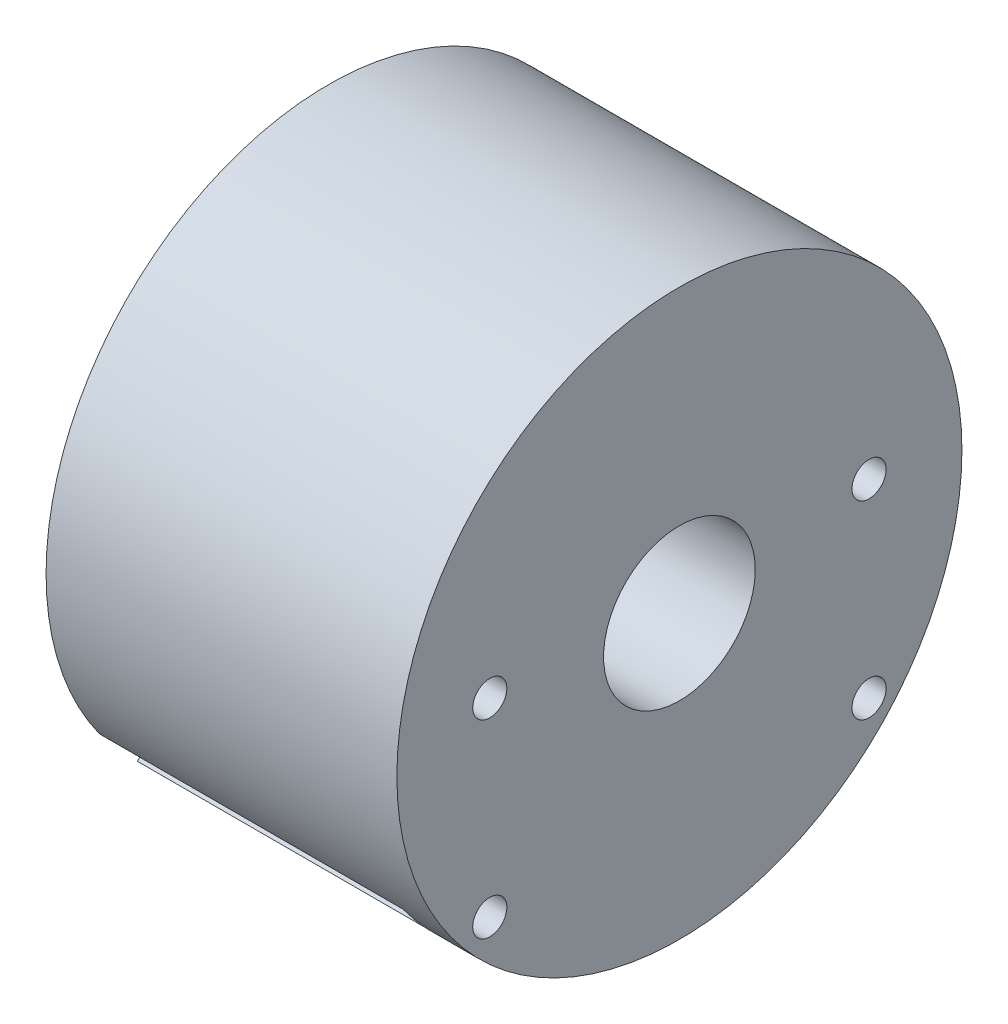
ISO-10303-21;
HEADER;
FILE_DESCRIPTION(('STEP AP214'),'2;1');
FILE_NAME('part.step','',(''),(''),'','','');
FILE_SCHEMA(('AUTOMOTIVE_DESIGN { 1 0 10303 214 1 1 1 1 }'));
ENDSEC;
DATA;
#1=APPLICATION_CONTEXT('core data for automotive mechanical design processes');
#2=APPLICATION_PROTOCOL_DEFINITION('international standard','automotive_design',2000,#1);
#3=PRODUCT_CONTEXT('',#1,'mechanical');
#4=PRODUCT('Part','Part','',(#3));
#5=PRODUCT_RELATED_PRODUCT_CATEGORY('part','',(#4));
#6=PRODUCT_DEFINITION_FORMATION('','',#4);
#7=PRODUCT_DEFINITION_CONTEXT('part definition',#1,'design');
#8=PRODUCT_DEFINITION('design','',#6,#7);
#9=PRODUCT_DEFINITION_SHAPE('','',#8);
#10=(LENGTH_UNIT() NAMED_UNIT(*) SI_UNIT(.MILLI.,.METRE.));
#11=(NAMED_UNIT(*) PLANE_ANGLE_UNIT() SI_UNIT($,.RADIAN.));
#12=(NAMED_UNIT(*) SI_UNIT($,.STERADIAN.) SOLID_ANGLE_UNIT());
#13=UNCERTAINTY_MEASURE_WITH_UNIT(LENGTH_MEASURE(1.E-05),#10,'distance_accuracy_value','');
#14=(GEOMETRIC_REPRESENTATION_CONTEXT(3) GLOBAL_UNCERTAINTY_ASSIGNED_CONTEXT((#13)) GLOBAL_UNIT_ASSIGNED_CONTEXT((#10,
#11,#12)) REPRESENTATION_CONTEXT('',''));
#15=CARTESIAN_POINT('',(0.,0.,0.));
#16=DIRECTION('',(0.,0.,1.));
#17=DIRECTION('',(1.,0.,0.));
#18=AXIS2_PLACEMENT_3D('',#15,#16,#17);
#19=CARTESIAN_POINT('',(-37.,0.,0.));
#20=DIRECTION('',(1.,0.,0.));
#21=DIRECTION('',(0.,0.,-1.));
#22=AXIS2_PLACEMENT_3D('',#19,#20,#21);
#23=PLANE('',#22);
#24=CARTESIAN_POINT('',(-37.,2.25000000000001,20.));
#25=DIRECTION('',(1.,0.,0.));
#26=DIRECTION('',(0.,0.,-1.));
#27=AXIS2_PLACEMENT_3D('',#24,#25,#26);
#28=CIRCLE('',#27,3.);
#29=CARTESIAN_POINT('',(-37.,2.25000000000001,17.));
#30=VERTEX_POINT('',#29);
#31=EDGE_CURVE('E117',#30,#30,#28,.T.);
#32=ORIENTED_EDGE('',*,*,#31,.T.);
#33=EDGE_LOOP('',(#32));
#34=FACE_BOUND('',#33,.T.);
#35=CARTESIAN_POINT('',(-37.,2.25000000000001,-20.));
#36=DIRECTION('',(1.,0.,0.));
#37=DIRECTION('',(0.,0.,-1.));
#38=AXIS2_PLACEMENT_3D('',#35,#36,#37);
#39=CIRCLE('',#38,3.);
#40=CARTESIAN_POINT('',(-37.,2.25000000000001,-23.));
#41=VERTEX_POINT('',#40);
#42=EDGE_CURVE('E177',#41,#41,#39,.T.);
#43=ORIENTED_EDGE('',*,*,#42,.T.);
#44=EDGE_LOOP('',(#43));
#45=FACE_BOUND('',#44,.T.);
#46=CARTESIAN_POINT('',(-37.,0.,0.));
#47=DIRECTION('',(1.,0.,0.));
#48=DIRECTION('',(0.,0.,-1.));
#49=AXIS2_PLACEMENT_3D('',#46,#47,#48);
#50=CIRCLE('',#49,8.);
#51=CARTESIAN_POINT('',(-37.,0.,-8.));
#52=VERTEX_POINT('',#51);
#53=EDGE_CURVE('E11',#52,#52,#50,.T.);
#54=ORIENTED_EDGE('',*,*,#53,.T.);
#55=EDGE_LOOP('',(#54));
#56=FACE_BOUND('',#55,.T.);
#57=CARTESIAN_POINT('',(-37.,0.,0.));
#58=DIRECTION('',(1.,0.,0.));
#59=DIRECTION('',(0.,0.,-1.));
#60=AXIS2_PLACEMENT_3D('',#57,#58,#59);
#61=CIRCLE('',#60,29.8);
#62=CARTESIAN_POINT('',(-37.,-17.4364781789354,-24.1662828899173));
#63=VERTEX_POINT('',#62);
#64=CARTESIAN_POINT('',(-37.,-17.4364781789354,24.1662828899173));
#65=VERTEX_POINT('',#64);
#66=EDGE_CURVE('E194',#63,#65,#61,.T.);
#67=ORIENTED_EDGE('',*,*,#66,.F.);
#68=DIRECTION('',(0.,-0.663783352029827,-0.747924903695583));
#69=VECTOR('',#68,1.);
#70=CARTESIAN_POINT('',(-37.,2.24377471108672,-1.99135005608946));
#71=LINE('',#70,#69);
#72=CARTESIAN_POINT('',(-37.,-15.5062252889132,-21.9913500560895));
#73=VERTEX_POINT('',#72);
#74=EDGE_CURVE('E161',#73,#63,#71,.T.);
#75=ORIENTED_EDGE('',*,*,#74,.F.);
#76=CARTESIAN_POINT('',(-37.,-17.75,-20.));
#77=DIRECTION('',(1.,0.,0.));
#78=DIRECTION('',(0.,0.,-1.));
#79=AXIS2_PLACEMENT_3D('',#76,#77,#78);
#80=CIRCLE('',#79,3.);
#81=CARTESIAN_POINT('',(-37.,-19.9937747110867,-18.0086499439105));
#82=VERTEX_POINT('',#81);
#83=EDGE_CURVE('E163',#73,#82,#80,.T.);
#84=ORIENTED_EDGE('',*,*,#83,.T.);
#85=DIRECTION('',(0.,-0.663783352029828,-0.747924903695582));
#86=VECTOR('',#85,1.);
#87=CARTESIAN_POINT('',(-37.,-2.24377471108677,1.99135005608951));
#88=LINE('',#87,#86);
#89=CARTESIAN_POINT('',(-37.,-21.9240276011089,-20.1835827777383));
#90=VERTEX_POINT('',#89);
#91=EDGE_CURVE('E153',#82,#90,#88,.T.);
#92=ORIENTED_EDGE('',*,*,#91,.T.);
#93=CARTESIAN_POINT('',(-37.,-21.9240276011089,20.1835827777383));
#94=VERTEX_POINT('',#93);
#95=EDGE_CURVE('E48',#94,#90,#61,.T.);
#96=ORIENTED_EDGE('',*,*,#95,.F.);
#97=DIRECTION('',(0.,-0.663783352029828,0.747924903695582));
#98=VECTOR('',#97,1.);
#99=CARTESIAN_POINT('',(-37.,-2.24377471108674,-1.99135005608948));
#100=LINE('',#99,#98);
#101=CARTESIAN_POINT('',(-37.,-19.9937747110867,18.0086499439105));
#102=VERTEX_POINT('',#101);
#103=EDGE_CURVE('E142',#102,#94,#100,.T.);
#104=ORIENTED_EDGE('',*,*,#103,.F.);
#105=CARTESIAN_POINT('',(-37.,-17.75,20.));
#106=DIRECTION('',(1.,0.,0.));
#107=DIRECTION('',(0.,0.,-1.));
#108=AXIS2_PLACEMENT_3D('',#105,#106,#107);
#109=CIRCLE('',#108,3.);
#110=CARTESIAN_POINT('',(-37.,-15.5062252889132,21.9913500560895));
#111=VERTEX_POINT('',#110);
#112=EDGE_CURVE('E113',#102,#111,#109,.T.);
#113=ORIENTED_EDGE('',*,*,#112,.T.);
#114=DIRECTION('',(0.,-0.66378335202983,0.747924903695581));
#115=VECTOR('',#114,1.);
#116=CARTESIAN_POINT('',(-37.,2.24377471108678,1.99135005608952));
#117=LINE('',#116,#115);
#118=EDGE_CURVE('E133',#111,#65,#117,.T.);
#119=ORIENTED_EDGE('',*,*,#118,.T.);
#120=EDGE_LOOP('',(#67,#75,#84,#92,#96,#104,#113,#119));
#121=FACE_BOUND('',#120,.T.);
#122=ADVANCED_FACE('F39',(#34,#45,#56,#121),#23,.F.);
#123=CARTESIAN_POINT('',(-37.,0.,0.));
#124=DIRECTION('',(1.,0.,0.));
#125=DIRECTION('',(0.,0.,-1.));
#126=AXIS2_PLACEMENT_3D('',#123,#124,#125);
#127=CYLINDRICAL_SURFACE('',#126,29.8);
#128=DIRECTION('',(-1.,0.,0.));
#129=VECTOR('',#128,1.);
#130=CARTESIAN_POINT('',(-5.,-17.4364781789354,-24.1662828899173));
#131=LINE('',#130,#129);
#132=CARTESIAN_POINT('',(-5.,-17.4364781789354,-24.1662828899173));
#133=VERTEX_POINT('',#132);
#134=EDGE_CURVE('E160',#133,#63,#131,.T.);
#135=ORIENTED_EDGE('',*,*,#134,.T.);
#136=ORIENTED_EDGE('',*,*,#66,.T.);
#137=DIRECTION('',(-1.,0.,0.));
#138=VECTOR('',#137,1.);
#139=CARTESIAN_POINT('',(-5.,-17.4364781789354,24.1662828899173));
#140=LINE('',#139,#138);
#141=CARTESIAN_POINT('',(-5.,-17.4364781789354,24.1662828899173));
#142=VERTEX_POINT('',#141);
#143=EDGE_CURVE('E64',#142,#65,#140,.T.);
#144=ORIENTED_EDGE('',*,*,#143,.F.);
#145=CARTESIAN_POINT('',(-5.,0.,0.));
#146=DIRECTION('',(1.,0.,0.));
#147=DIRECTION('',(0.,0.,-1.));
#148=AXIS2_PLACEMENT_3D('',#145,#146,#147);
#149=CIRCLE('',#148,29.8);
#150=CARTESIAN_POINT('',(-5.,-21.9240276011089,20.1835827777383));
#151=VERTEX_POINT('',#150);
#152=EDGE_CURVE('E140',#142,#151,#149,.T.);
#153=ORIENTED_EDGE('',*,*,#152,.T.);
#154=DIRECTION('',(-1.,0.,0.));
#155=VECTOR('',#154,1.);
#156=CARTESIAN_POINT('',(-5.,-21.9240276011089,20.1835827777383));
#157=LINE('',#156,#155);
#158=EDGE_CURVE('E132',#151,#94,#157,.T.);
#159=ORIENTED_EDGE('',*,*,#158,.T.);
#160=ORIENTED_EDGE('',*,*,#95,.T.);
#161=DIRECTION('',(-1.,0.,0.));
#162=VECTOR('',#161,1.);
#163=CARTESIAN_POINT('',(-5.,-21.9240276011089,-20.1835827777383));
#164=LINE('',#163,#162);
#165=CARTESIAN_POINT('',(-5.,-21.9240276011089,-20.1835827777383));
#166=VERTEX_POINT('',#165);
#167=EDGE_CURVE('E56',#166,#90,#164,.T.);
#168=ORIENTED_EDGE('',*,*,#167,.F.);
#169=CARTESIAN_POINT('',(-5.,0.,0.));
#170=DIRECTION('',(1.,0.,0.));
#171=DIRECTION('',(0.,0.,-1.));
#172=AXIS2_PLACEMENT_3D('',#169,#170,#171);
#173=CIRCLE('',#172,29.8);
#174=EDGE_CURVE('E157',#166,#133,#173,.T.);
#175=ORIENTED_EDGE('',*,*,#174,.T.);
#176=EDGE_LOOP('',(#135,#136,#144,#153,#159,#160,#168,#175));
#177=FACE_BOUND('',#176,.T.);
#178=CARTESIAN_POINT('',(0.,0.,0.));
#179=DIRECTION('',(1.,0.,0.));
#180=DIRECTION('',(0.,0.,-1.));
#181=AXIS2_PLACEMENT_3D('',#178,#179,#180);
#182=CIRCLE('',#181,29.8);
#183=CARTESIAN_POINT('',(0.,0.,-29.8));
#184=VERTEX_POINT('',#183);
#185=EDGE_CURVE('E193',#184,#184,#182,.T.);
#186=ORIENTED_EDGE('',*,*,#185,.F.);
#187=EDGE_LOOP('',(#186));
#188=FACE_BOUND('',#187,.T.);
#189=ADVANCED_FACE('F41',(#177,#188),#127,.T.);
#190=CARTESIAN_POINT('',(-37.,0.,0.));
#191=DIRECTION('',(1.,0.,0.));
#192=DIRECTION('',(0.,0.,-1.));
#193=AXIS2_PLACEMENT_3D('',#190,#191,#192);
#194=CYLINDRICAL_SURFACE('',#193,8.);
#195=ORIENTED_EDGE('',*,*,#53,.F.);
#196=EDGE_LOOP('',(#195));
#197=FACE_BOUND('',#196,.T.);
#198=CARTESIAN_POINT('',(0.,0.,0.));
#199=DIRECTION('',(1.,0.,0.));
#200=DIRECTION('',(0.,0.,-1.));
#201=AXIS2_PLACEMENT_3D('',#198,#199,#200);
#202=CIRCLE('',#201,8.);
#203=CARTESIAN_POINT('',(0.,0.,-8.));
#204=VERTEX_POINT('',#203);
#205=EDGE_CURVE('E196',#204,#204,#202,.T.);
#206=ORIENTED_EDGE('',*,*,#205,.T.);
#207=EDGE_LOOP('',(#206));
#208=FACE_BOUND('',#207,.T.);
#209=ADVANCED_FACE('F238',(#197,#208),#194,.F.);
#210=CARTESIAN_POINT('',(0.,0.,0.));
#211=DIRECTION('',(1.,0.,0.));
#212=DIRECTION('',(0.,0.,-1.));
#213=AXIS2_PLACEMENT_3D('',#210,#211,#212);
#214=PLANE('',#213);
#215=CARTESIAN_POINT('',(0.,2.25000000000001,-20.));
#216=DIRECTION('',(-1.,0.,0.));
#217=DIRECTION('',(0.,0.,1.));
#218=AXIS2_PLACEMENT_3D('',#215,#216,#217);
#219=CIRCLE('',#218,1.79999999999999);
#220=CARTESIAN_POINT('',(0.,2.25000000000001,-18.2));
#221=VERTEX_POINT('',#220);
#222=EDGE_CURVE('E181',#221,#221,#219,.T.);
#223=ORIENTED_EDGE('',*,*,#222,.T.);
#224=EDGE_LOOP('',(#223));
#225=FACE_BOUND('',#224,.T.);
#226=CARTESIAN_POINT('',(0.,2.25000000000001,20.));
#227=DIRECTION('',(-1.,0.,0.));
#228=DIRECTION('',(0.,0.,1.));
#229=AXIS2_PLACEMENT_3D('',#226,#227,#228);
#230=CIRCLE('',#229,1.79999999999999);
#231=CARTESIAN_POINT('',(0.,2.25000000000001,21.8));
#232=VERTEX_POINT('',#231);
#233=EDGE_CURVE('E184',#232,#232,#230,.T.);
#234=ORIENTED_EDGE('',*,*,#233,.T.);
#235=EDGE_LOOP('',(#234));
#236=FACE_BOUND('',#235,.T.);
#237=CARTESIAN_POINT('',(0.,-17.75,20.));
#238=DIRECTION('',(-1.,0.,0.));
#239=DIRECTION('',(0.,0.,1.));
#240=AXIS2_PLACEMENT_3D('',#237,#238,#239);
#241=CIRCLE('',#240,1.79999999999999);
#242=CARTESIAN_POINT('',(0.,-17.75,21.8));
#243=VERTEX_POINT('',#242);
#244=EDGE_CURVE('E187',#243,#243,#241,.T.);
#245=ORIENTED_EDGE('',*,*,#244,.T.);
#246=EDGE_LOOP('',(#245));
#247=FACE_BOUND('',#246,.T.);
#248=CARTESIAN_POINT('',(0.,-17.75,-20.));
#249=DIRECTION('',(-1.,0.,0.));
#250=DIRECTION('',(0.,0.,1.));
#251=AXIS2_PLACEMENT_3D('',#248,#249,#250);
#252=CIRCLE('',#251,1.79999999999999);
#253=CARTESIAN_POINT('',(0.,-17.75,-18.2));
#254=VERTEX_POINT('',#253);
#255=EDGE_CURVE('E190',#254,#254,#252,.T.);
#256=ORIENTED_EDGE('',*,*,#255,.T.);
#257=EDGE_LOOP('',(#256));
#258=FACE_BOUND('',#257,.T.);
#259=ORIENTED_EDGE('',*,*,#185,.T.);
#260=EDGE_LOOP('',(#259));
#261=FACE_BOUND('',#260,.T.);
#262=ORIENTED_EDGE('',*,*,#205,.F.);
#263=EDGE_LOOP('',(#262));
#264=FACE_BOUND('',#263,.T.);
#265=ADVANCED_FACE('F245',(#225,#236,#247,#258,#261,#264),#214,.T.);
#266=CARTESIAN_POINT('',(-37.,-17.75,-20.));
#267=DIRECTION('',(-1.,0.,0.));
#268=DIRECTION('',(0.,0.,1.));
#269=AXIS2_PLACEMENT_3D('',#266,#267,#268);
#270=CYLINDRICAL_SURFACE('',#269,1.79999999999999);
#271=CARTESIAN_POINT('',(-5.,-17.75,-20.));
#272=DIRECTION('',(1.,0.,0.));
#273=DIRECTION('',(0.,0.,-1.));
#274=AXIS2_PLACEMENT_3D('',#271,#272,#273);
#275=CIRCLE('',#274,1.79999999999999);
#276=CARTESIAN_POINT('',(-5.,-17.75,-21.8));
#277=VERTEX_POINT('',#276);
#278=EDGE_CURVE('E43',#277,#277,#275,.F.);
#279=ORIENTED_EDGE('',*,*,#278,.T.);
#280=EDGE_LOOP('',(#279));
#281=FACE_BOUND('',#280,.T.);
#282=ORIENTED_EDGE('',*,*,#255,.F.);
#283=EDGE_LOOP('',(#282));
#284=FACE_BOUND('',#283,.T.);
#285=ADVANCED_FACE('F213',(#281,#284),#270,.F.);
#286=CARTESIAN_POINT('',(-37.,-17.75,20.));
#287=DIRECTION('',(-1.,0.,0.));
#288=DIRECTION('',(0.,0.,1.));
#289=AXIS2_PLACEMENT_3D('',#286,#287,#288);
#290=CYLINDRICAL_SURFACE('',#289,1.79999999999999);
#291=CARTESIAN_POINT('',(-5.,-17.75,20.));
#292=DIRECTION('',(1.,0.,0.));
#293=DIRECTION('',(0.,0.,-1.));
#294=AXIS2_PLACEMENT_3D('',#291,#292,#293);
#295=CIRCLE('',#294,1.79999999999999);
#296=CARTESIAN_POINT('',(-5.,-17.75,18.2));
#297=VERTEX_POINT('',#296);
#298=EDGE_CURVE('E206',#297,#297,#295,.F.);
#299=ORIENTED_EDGE('',*,*,#298,.T.);
#300=EDGE_LOOP('',(#299));
#301=FACE_BOUND('',#300,.T.);
#302=ORIENTED_EDGE('',*,*,#244,.F.);
#303=EDGE_LOOP('',(#302));
#304=FACE_BOUND('',#303,.T.);
#305=ADVANCED_FACE('F292',(#301,#304),#290,.F.);
#306=CARTESIAN_POINT('',(-37.,2.25000000000001,20.));
#307=DIRECTION('',(-1.,0.,0.));
#308=DIRECTION('',(0.,0.,1.));
#309=AXIS2_PLACEMENT_3D('',#306,#307,#308);
#310=CYLINDRICAL_SURFACE('',#309,1.8);
#311=CARTESIAN_POINT('',(-5.,2.25000000000001,20.));
#312=DIRECTION('',(1.,0.,0.));
#313=DIRECTION('',(0.,0.,-1.));
#314=AXIS2_PLACEMENT_3D('',#311,#312,#313);
#315=CIRCLE('',#314,1.8);
#316=CARTESIAN_POINT('',(-5.,2.25000000000001,18.2));
#317=VERTEX_POINT('',#316);
#318=EDGE_CURVE('E204',#317,#317,#315,.F.);
#319=ORIENTED_EDGE('',*,*,#318,.T.);
#320=EDGE_LOOP('',(#319));
#321=FACE_BOUND('',#320,.T.);
#322=ORIENTED_EDGE('',*,*,#233,.F.);
#323=EDGE_LOOP('',(#322));
#324=FACE_BOUND('',#323,.T.);
#325=ADVANCED_FACE('F289',(#321,#324),#310,.F.);
#326=CARTESIAN_POINT('',(-37.,2.25000000000001,-20.));
#327=DIRECTION('',(-1.,0.,0.));
#328=DIRECTION('',(0.,0.,1.));
#329=AXIS2_PLACEMENT_3D('',#326,#327,#328);
#330=CYLINDRICAL_SURFACE('',#329,1.8);
#331=CARTESIAN_POINT('',(-5.,2.25000000000001,-20.));
#332=DIRECTION('',(1.,0.,0.));
#333=DIRECTION('',(0.,0.,-1.));
#334=AXIS2_PLACEMENT_3D('',#331,#332,#333);
#335=CIRCLE('',#334,1.8);
#336=CARTESIAN_POINT('',(-5.,2.25000000000001,-21.8));
#337=VERTEX_POINT('',#336);
#338=EDGE_CURVE('E176',#337,#337,#335,.F.);
#339=ORIENTED_EDGE('',*,*,#338,.T.);
#340=EDGE_LOOP('',(#339));
#341=FACE_BOUND('',#340,.T.);
#342=ORIENTED_EDGE('',*,*,#222,.F.);
#343=EDGE_LOOP('',(#342));
#344=FACE_BOUND('',#343,.T.);
#345=ADVANCED_FACE('F281',(#341,#344),#330,.F.);
#346=CARTESIAN_POINT('',(-5.,0.,0.));
#347=DIRECTION('',(1.,0.,0.));
#348=DIRECTION('',(0.,0.,-1.));
#349=AXIS2_PLACEMENT_3D('',#346,#347,#348);
#350=PLANE('',#349);
#351=CARTESIAN_POINT('',(-5.,2.25000000000001,-20.));
#352=DIRECTION('',(1.,0.,0.));
#353=DIRECTION('',(0.,0.,-1.));
#354=AXIS2_PLACEMENT_3D('',#351,#352,#353);
#355=CIRCLE('',#354,3.);
#356=CARTESIAN_POINT('',(-5.,2.25000000000001,-23.));
#357=VERTEX_POINT('',#356);
#358=EDGE_CURVE('E173',#357,#357,#355,.T.);
#359=ORIENTED_EDGE('',*,*,#358,.F.);
#360=EDGE_LOOP('',(#359));
#361=FACE_BOUND('',#360,.T.);
#362=ORIENTED_EDGE('',*,*,#338,.F.);
#363=EDGE_LOOP('',(#362));
#364=FACE_BOUND('',#363,.T.);
#365=ADVANCED_FACE('F277',(#361,#364),#350,.F.);
#366=CARTESIAN_POINT('',(-5.,2.25000000000001,-20.));
#367=DIRECTION('',(-1.,0.,0.));
#368=DIRECTION('',(0.,0.,1.));
#369=AXIS2_PLACEMENT_3D('',#366,#367,#368);
#370=CYLINDRICAL_SURFACE('',#369,3.);
#371=ORIENTED_EDGE('',*,*,#358,.T.);
#372=EDGE_LOOP('',(#371));
#373=FACE_BOUND('',#372,.T.);
#374=ORIENTED_EDGE('',*,*,#42,.F.);
#375=EDGE_LOOP('',(#374));
#376=FACE_BOUND('',#375,.T.);
#377=ADVANCED_FACE('F280',(#373,#376),#370,.F.);
#378=CARTESIAN_POINT('',(-5.,0.,0.));
#379=DIRECTION('',(1.,0.,0.));
#380=DIRECTION('',(0.,0.,-1.));
#381=AXIS2_PLACEMENT_3D('',#378,#379,#380);
#382=PLANE('',#381);
#383=CARTESIAN_POINT('',(-5.,2.25000000000001,20.));
#384=DIRECTION('',(1.,0.,0.));
#385=DIRECTION('',(0.,0.,-1.));
#386=AXIS2_PLACEMENT_3D('',#383,#384,#385);
#387=CIRCLE('',#386,3.);
#388=CARTESIAN_POINT('',(-5.,2.25000000000001,17.));
#389=VERTEX_POINT('',#388);
#390=EDGE_CURVE('E180',#389,#389,#387,.T.);
#391=ORIENTED_EDGE('',*,*,#390,.F.);
#392=EDGE_LOOP('',(#391));
#393=FACE_BOUND('',#392,.T.);
#394=ORIENTED_EDGE('',*,*,#318,.F.);
#395=EDGE_LOOP('',(#394));
#396=FACE_BOUND('',#395,.T.);
#397=ADVANCED_FACE('F285',(#393,#396),#382,.F.);
#398=CARTESIAN_POINT('',(-5.,2.25000000000001,20.));
#399=DIRECTION('',(-1.,0.,0.));
#400=DIRECTION('',(0.,0.,1.));
#401=AXIS2_PLACEMENT_3D('',#398,#399,#400);
#402=CYLINDRICAL_SURFACE('',#401,3.);
#403=ORIENTED_EDGE('',*,*,#390,.T.);
#404=EDGE_LOOP('',(#403));
#405=FACE_BOUND('',#404,.T.);
#406=ORIENTED_EDGE('',*,*,#31,.F.);
#407=EDGE_LOOP('',(#406));
#408=FACE_BOUND('',#407,.T.);
#409=ADVANCED_FACE('F385',(#405,#408),#402,.F.);
#410=CARTESIAN_POINT('',(-5.,0.,0.));
#411=DIRECTION('',(1.,0.,0.));
#412=DIRECTION('',(0.,0.,-1.));
#413=AXIS2_PLACEMENT_3D('',#410,#411,#412);
#414=PLANE('',#413);
#415=DIRECTION('',(0.,-0.663783352029828,0.747924903695582));
#416=VECTOR('',#415,1.);
#417=CARTESIAN_POINT('',(-5.,-2.24377471108674,-1.99135005608948));
#418=LINE('',#417,#416);
#419=CARTESIAN_POINT('',(-5.,-19.9937747110867,18.0086499439105));
#420=VERTEX_POINT('',#419);
#421=EDGE_CURVE('E126',#420,#151,#418,.T.);
#422=ORIENTED_EDGE('',*,*,#421,.T.);
#423=ORIENTED_EDGE('',*,*,#152,.F.);
#424=DIRECTION('',(0.,-0.66378335202983,0.747924903695581));
#425=VECTOR('',#424,1.);
#426=CARTESIAN_POINT('',(-5.,2.24377471108678,1.99135005608952));
#427=LINE('',#426,#425);
#428=CARTESIAN_POINT('',(-5.,-15.5062252889132,21.9913500560895));
#429=VERTEX_POINT('',#428);
#430=EDGE_CURVE('E128',#429,#142,#427,.T.);
#431=ORIENTED_EDGE('',*,*,#430,.F.);
#432=CARTESIAN_POINT('',(-5.,-17.75,20.));
#433=DIRECTION('',(1.,0.,0.));
#434=DIRECTION('',(0.,0.,-1.));
#435=AXIS2_PLACEMENT_3D('',#432,#433,#434);
#436=CIRCLE('',#435,3.);
#437=EDGE_CURVE('E110',#420,#429,#436,.T.);
#438=ORIENTED_EDGE('',*,*,#437,.F.);
#439=EDGE_LOOP('',(#422,#423,#431,#438));
#440=FACE_BOUND('',#439,.T.);
#441=ORIENTED_EDGE('',*,*,#298,.F.);
#442=EDGE_LOOP('',(#441));
#443=FACE_BOUND('',#442,.T.);
#444=ADVANCED_FACE('F123',(#440,#443),#414,.F.);
#445=CARTESIAN_POINT('',(-5.,-2.24377471108674,-1.99135005608948));
#446=DIRECTION('',(0.,-0.747924903695582,-0.663783352029828));
#447=DIRECTION('',(0.,0.663783352029828,-0.747924903695582));
#448=AXIS2_PLACEMENT_3D('',#445,#446,#447);
#449=PLANE('',#448);
#450=ORIENTED_EDGE('',*,*,#103,.T.);
#451=ORIENTED_EDGE('',*,*,#158,.F.);
#452=ORIENTED_EDGE('',*,*,#421,.F.);
#453=DIRECTION('',(-1.,0.,0.));
#454=VECTOR('',#453,1.);
#455=CARTESIAN_POINT('',(-5.,-19.9937747110867,18.0086499439105));
#456=LINE('',#455,#454);
#457=EDGE_CURVE('E107',#420,#102,#456,.T.);
#458=ORIENTED_EDGE('',*,*,#457,.T.);
#459=EDGE_LOOP('',(#450,#451,#452,#458));
#460=FACE_BOUND('',#459,.T.);
#461=ADVANCED_FACE('F130',(#460),#449,.F.);
#462=CARTESIAN_POINT('',(-5.,-17.75,20.));
#463=DIRECTION('',(-1.,0.,0.));
#464=DIRECTION('',(0.,0.,1.));
#465=AXIS2_PLACEMENT_3D('',#462,#463,#464);
#466=CYLINDRICAL_SURFACE('',#465,3.);
#467=ORIENTED_EDGE('',*,*,#112,.F.);
#468=ORIENTED_EDGE('',*,*,#457,.F.);
#469=ORIENTED_EDGE('',*,*,#437,.T.);
#470=DIRECTION('',(-1.,0.,0.));
#471=VECTOR('',#470,1.);
#472=CARTESIAN_POINT('',(-5.,-15.5062252889132,21.9913500560895));
#473=LINE('',#472,#471);
#474=EDGE_CURVE('E118',#429,#111,#473,.T.);
#475=ORIENTED_EDGE('',*,*,#474,.T.);
#476=EDGE_LOOP('',(#467,#468,#469,#475));
#477=FACE_BOUND('',#476,.T.);
#478=ADVANCED_FACE('F109',(#477),#466,.F.);
#479=CARTESIAN_POINT('',(-5.,2.24377471108678,1.99135005608952));
#480=DIRECTION('',(0.,-0.747924903695581,-0.66378335202983));
#481=DIRECTION('',(0.,0.66378335202983,-0.747924903695581));
#482=AXIS2_PLACEMENT_3D('',#479,#480,#481);
#483=PLANE('',#482);
#484=ORIENTED_EDGE('',*,*,#118,.F.);
#485=ORIENTED_EDGE('',*,*,#474,.F.);
#486=ORIENTED_EDGE('',*,*,#430,.T.);
#487=ORIENTED_EDGE('',*,*,#143,.T.);
#488=EDGE_LOOP('',(#484,#485,#486,#487));
#489=FACE_BOUND('',#488,.T.);
#490=ADVANCED_FACE('F219',(#489),#483,.T.);
#491=CARTESIAN_POINT('',(-5.,0.,0.));
#492=DIRECTION('',(1.,0.,0.));
#493=DIRECTION('',(0.,0.,-1.));
#494=AXIS2_PLACEMENT_3D('',#491,#492,#493);
#495=PLANE('',#494);
#496=DIRECTION('',(0.,-0.663783352029827,-0.747924903695583));
#497=VECTOR('',#496,1.);
#498=CARTESIAN_POINT('',(-5.,2.24377471108672,-1.99135005608946));
#499=LINE('',#498,#497);
#500=CARTESIAN_POINT('',(-5.,-15.5062252889132,-21.9913500560895));
#501=VERTEX_POINT('',#500);
#502=EDGE_CURVE('E149',#501,#133,#499,.T.);
#503=ORIENTED_EDGE('',*,*,#502,.T.);
#504=ORIENTED_EDGE('',*,*,#174,.F.);
#505=DIRECTION('',(0.,-0.663783352029828,-0.747924903695582));
#506=VECTOR('',#505,1.);
#507=CARTESIAN_POINT('',(-5.,-2.24377471108677,1.99135005608951));
#508=LINE('',#507,#506);
#509=CARTESIAN_POINT('',(-5.,-19.9937747110867,-18.0086499439105));
#510=VERTEX_POINT('',#509);
#511=EDGE_CURVE('E155',#510,#166,#508,.T.);
#512=ORIENTED_EDGE('',*,*,#511,.F.);
#513=CARTESIAN_POINT('',(-5.,-17.75,-20.));
#514=DIRECTION('',(1.,0.,0.));
#515=DIRECTION('',(0.,0.,-1.));
#516=AXIS2_PLACEMENT_3D('',#513,#514,#515);
#517=CIRCLE('',#516,3.);
#518=EDGE_CURVE('E152',#501,#510,#517,.T.);
#519=ORIENTED_EDGE('',*,*,#518,.F.);
#520=EDGE_LOOP('',(#503,#504,#512,#519));
#521=FACE_BOUND('',#520,.T.);
#522=ORIENTED_EDGE('',*,*,#278,.F.);
#523=EDGE_LOOP('',(#522));
#524=FACE_BOUND('',#523,.T.);
#525=ADVANCED_FACE('F216',(#521,#524),#495,.F.);
#526=CARTESIAN_POINT('',(-5.,2.24377471108672,-1.99135005608946));
#527=DIRECTION('',(0.,0.747924903695583,-0.663783352029827));
#528=DIRECTION('',(0.,0.663783352029827,0.747924903695583));
#529=AXIS2_PLACEMENT_3D('',#526,#527,#528);
#530=PLANE('',#529);
#531=ORIENTED_EDGE('',*,*,#74,.T.);
#532=ORIENTED_EDGE('',*,*,#134,.F.);
#533=ORIENTED_EDGE('',*,*,#502,.F.);
#534=DIRECTION('',(-1.,0.,0.));
#535=VECTOR('',#534,1.);
#536=CARTESIAN_POINT('',(-5.,-15.5062252889132,-21.9913500560895));
#537=LINE('',#536,#535);
#538=EDGE_CURVE('E144',#501,#73,#537,.T.);
#539=ORIENTED_EDGE('',*,*,#538,.T.);
#540=EDGE_LOOP('',(#531,#532,#533,#539));
#541=FACE_BOUND('',#540,.T.);
#542=ADVANCED_FACE('F218',(#541),#530,.F.);
#543=CARTESIAN_POINT('',(-5.,-17.75,-20.));
#544=DIRECTION('',(-1.,0.,0.));
#545=DIRECTION('',(0.,0.,1.));
#546=AXIS2_PLACEMENT_3D('',#543,#544,#545);
#547=CYLINDRICAL_SURFACE('',#546,3.);
#548=ORIENTED_EDGE('',*,*,#83,.F.);
#549=ORIENTED_EDGE('',*,*,#538,.F.);
#550=ORIENTED_EDGE('',*,*,#518,.T.);
#551=DIRECTION('',(-1.,0.,0.));
#552=VECTOR('',#551,1.);
#553=CARTESIAN_POINT('',(-5.,-19.9937747110867,-18.0086499439105));
#554=LINE('',#553,#552);
#555=EDGE_CURVE('E170',#510,#82,#554,.T.);
#556=ORIENTED_EDGE('',*,*,#555,.T.);
#557=EDGE_LOOP('',(#548,#549,#550,#556));
#558=FACE_BOUND('',#557,.T.);
#559=ADVANCED_FACE('F226',(#558),#547,.F.);
#560=CARTESIAN_POINT('',(-5.,-2.24377471108677,1.99135005608951));
#561=DIRECTION('',(0.,0.747924903695582,-0.663783352029828));
#562=DIRECTION('',(0.,0.663783352029828,0.747924903695582));
#563=AXIS2_PLACEMENT_3D('',#560,#561,#562);
#564=PLANE('',#563);
#565=ORIENTED_EDGE('',*,*,#91,.F.);
#566=ORIENTED_EDGE('',*,*,#555,.F.);
#567=ORIENTED_EDGE('',*,*,#511,.T.);
#568=ORIENTED_EDGE('',*,*,#167,.T.);
#569=EDGE_LOOP('',(#565,#566,#567,#568));
#570=FACE_BOUND('',#569,.T.);
#571=ADVANCED_FACE('F268',(#570),#564,.T.);
#572=CLOSED_SHELL('',(#122,#189,#209,#265,#285,#305,#325,#345,#365,#377,#397,#409,#444,#461,
#478,#490,#525,#542,#559,#571));
#573=MANIFOLD_SOLID_BREP('B2',#572);
#574=ADVANCED_BREP_SHAPE_REPRESENTATION('',(#18,#573),#14);
#575=SHAPE_DEFINITION_REPRESENTATION(#9,#574);
ENDSEC;
END-ISO-10303-21;
